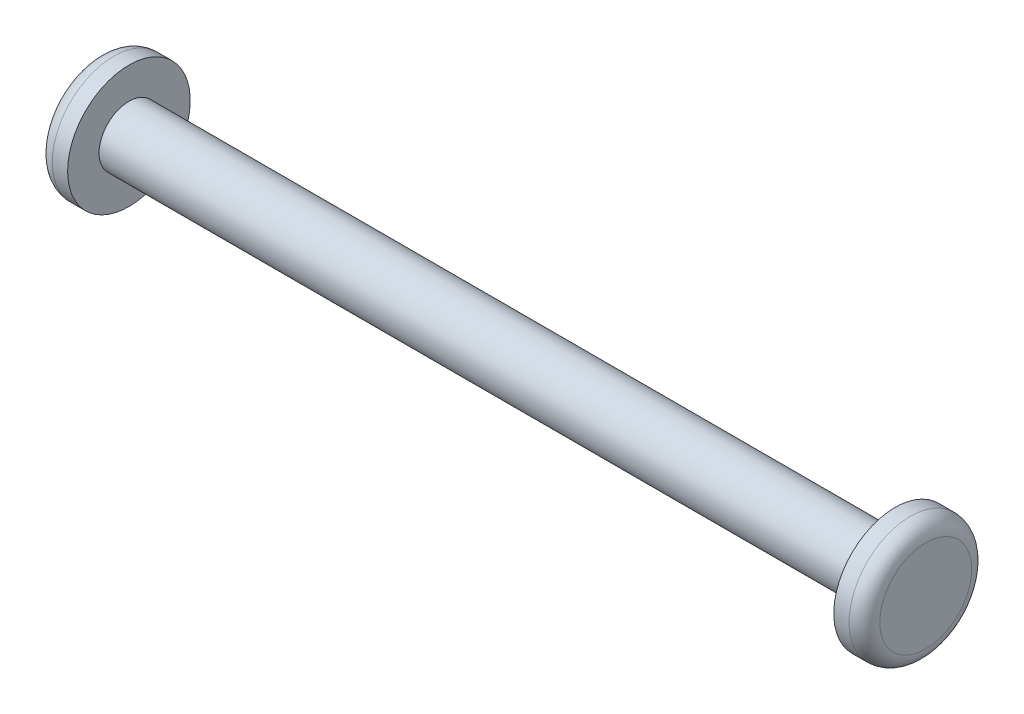
ISO-10303-21;
HEADER;
FILE_DESCRIPTION(('STEP AP214'),'2;1');
FILE_NAME('part.step','',(''),(''),'','','');
FILE_SCHEMA(('AUTOMOTIVE_DESIGN { 1 0 10303 214 1 1 1 1 }'));
ENDSEC;
DATA;
#1=APPLICATION_CONTEXT('core data for automotive mechanical design processes');
#2=APPLICATION_PROTOCOL_DEFINITION('international standard','automotive_design',2000,#1);
#3=PRODUCT_CONTEXT('',#1,'mechanical');
#4=PRODUCT('Part','Part','',(#3));
#5=PRODUCT_RELATED_PRODUCT_CATEGORY('part','',(#4));
#6=PRODUCT_DEFINITION_FORMATION('','',#4);
#7=PRODUCT_DEFINITION_CONTEXT('part definition',#1,'design');
#8=PRODUCT_DEFINITION('design','',#6,#7);
#9=PRODUCT_DEFINITION_SHAPE('','',#8);
#10=(LENGTH_UNIT() NAMED_UNIT(*) SI_UNIT(.MILLI.,.METRE.));
#11=(NAMED_UNIT(*) PLANE_ANGLE_UNIT() SI_UNIT($,.RADIAN.));
#12=(NAMED_UNIT(*) SI_UNIT($,.STERADIAN.) SOLID_ANGLE_UNIT());
#13=UNCERTAINTY_MEASURE_WITH_UNIT(LENGTH_MEASURE(1.E-05),#10,'distance_accuracy_value','');
#14=(GEOMETRIC_REPRESENTATION_CONTEXT(3) GLOBAL_UNCERTAINTY_ASSIGNED_CONTEXT((#13)) GLOBAL_UNIT_ASSIGNED_CONTEXT((#10,
#11,#12)) REPRESENTATION_CONTEXT('',''));
#15=CARTESIAN_POINT('',(0.,0.,0.));
#16=DIRECTION('',(0.,0.,1.));
#17=DIRECTION('',(1.,0.,0.));
#18=AXIS2_PLACEMENT_3D('',#15,#16,#17);
#19=CARTESIAN_POINT('',(-74.,5.,-185.068788376854));
#20=DIRECTION('',(1.,0.,0.));
#21=DIRECTION('',(0.,0.,-1.));
#22=AXIS2_PLACEMENT_3D('',#19,#20,#21);
#23=CYLINDRICAL_SURFACE('',#22,3.99999999999999);
#24=CARTESIAN_POINT('',(-73.,5.,-185.068788376854));
#25=DIRECTION('',(1.,0.,0.));
#26=DIRECTION('',(0.,0.,-1.));
#27=AXIS2_PLACEMENT_3D('',#24,#25,#26);
#28=CIRCLE('',#27,3.99999999999999);
#29=CARTESIAN_POINT('',(-73.,5.,-189.068788376854));
#30=VERTEX_POINT('',#29);
#31=EDGE_CURVE('E10',#30,#30,#28,.F.);
#32=ORIENTED_EDGE('',*,*,#31,.T.);
#33=EDGE_LOOP('',(#32));
#34=FACE_BOUND('',#33,.T.);
#35=CARTESIAN_POINT('',(-74.,5.,-185.068788376854));
#36=DIRECTION('',(1.,0.,0.));
#37=DIRECTION('',(0.,0.,-1.));
#38=AXIS2_PLACEMENT_3D('',#35,#36,#37);
#39=CIRCLE('',#38,3.99999999999999);
#40=CARTESIAN_POINT('',(-74.,5.,-189.068788376854));
#41=VERTEX_POINT('',#40);
#42=EDGE_CURVE('E60',#41,#41,#39,.T.);
#43=ORIENTED_EDGE('',*,*,#42,.T.);
#44=EDGE_LOOP('',(#43));
#45=FACE_BOUND('',#44,.T.);
#46=ADVANCED_FACE('F39',(#34,#45),#23,.T.);
#47=CARTESIAN_POINT('',(-129.,5.,-185.068788376854));
#48=DIRECTION('',(1.,0.,0.));
#49=DIRECTION('',(0.,0.,-1.));
#50=AXIS2_PLACEMENT_3D('',#47,#48,#49);
#51=CYLINDRICAL_SURFACE('',#50,1.95);
#52=CARTESIAN_POINT('',(-74.,5.,-185.068788376854));
#53=DIRECTION('',(-1.,0.,0.));
#54=DIRECTION('',(0.,0.,1.));
#55=AXIS2_PLACEMENT_3D('',#52,#53,#54);
#56=CIRCLE('',#55,1.95);
#57=CARTESIAN_POINT('',(-74.,5.,-183.118788376854));
#58=VERTEX_POINT('',#57);
#59=EDGE_CURVE('E59',#58,#58,#56,.T.);
#60=ORIENTED_EDGE('',*,*,#59,.T.);
#61=EDGE_LOOP('',(#60));
#62=FACE_BOUND('',#61,.T.);
#63=CARTESIAN_POINT('',(-124.,5.,-185.068788376854));
#64=DIRECTION('',(-1.,0.,0.));
#65=DIRECTION('',(0.,0.,1.));
#66=AXIS2_PLACEMENT_3D('',#63,#64,#65);
#67=CIRCLE('',#66,1.95);
#68=CARTESIAN_POINT('',(-124.,5.,-183.118788376854));
#69=VERTEX_POINT('',#68);
#70=EDGE_CURVE('E63',#69,#69,#67,.T.);
#71=ORIENTED_EDGE('',*,*,#70,.F.);
#72=EDGE_LOOP('',(#71));
#73=FACE_BOUND('',#72,.T.);
#74=ADVANCED_FACE('F92',(#62,#73),#51,.T.);
#75=CARTESIAN_POINT('',(-74.,5.,-185.068788376854));
#76=DIRECTION('',(1.,0.,0.));
#77=DIRECTION('',(0.,0.,-1.));
#78=AXIS2_PLACEMENT_3D('',#75,#76,#77);
#79=PLANE('',#78);
#80=ORIENTED_EDGE('',*,*,#59,.F.);
#81=EDGE_LOOP('',(#80));
#82=FACE_BOUND('',#81,.T.);
#83=ORIENTED_EDGE('',*,*,#42,.F.);
#84=EDGE_LOOP('',(#83));
#85=FACE_BOUND('',#84,.T.);
#86=ADVANCED_FACE('F97',(#82,#85),#79,.F.);
#87=CARTESIAN_POINT('',(-126.,5.,-185.068788376854));
#88=DIRECTION('',(1.,0.,0.));
#89=DIRECTION('',(0.,0.,-1.));
#90=AXIS2_PLACEMENT_3D('',#87,#88,#89);
#91=CYLINDRICAL_SURFACE('',#90,3.99999999999999);
#92=CARTESIAN_POINT('',(-125.,5.,-185.068788376854));
#93=DIRECTION('',(-1.,0.,0.));
#94=DIRECTION('',(0.,0.,1.));
#95=AXIS2_PLACEMENT_3D('',#92,#93,#94);
#96=CIRCLE('',#95,3.99999999999999);
#97=CARTESIAN_POINT('',(-125.,5.,-181.068788376854));
#98=VERTEX_POINT('',#97);
#99=EDGE_CURVE('E50',#98,#98,#96,.F.);
#100=ORIENTED_EDGE('',*,*,#99,.T.);
#101=EDGE_LOOP('',(#100));
#102=FACE_BOUND('',#101,.T.);
#103=CARTESIAN_POINT('',(-124.,5.,-185.068788376854));
#104=DIRECTION('',(-1.,0.,0.));
#105=DIRECTION('',(0.,0.,1.));
#106=AXIS2_PLACEMENT_3D('',#103,#104,#105);
#107=CIRCLE('',#106,3.99999999999999);
#108=CARTESIAN_POINT('',(-124.,5.,-181.068788376854));
#109=VERTEX_POINT('',#108);
#110=EDGE_CURVE('E68',#109,#109,#107,.T.);
#111=ORIENTED_EDGE('',*,*,#110,.T.);
#112=EDGE_LOOP('',(#111));
#113=FACE_BOUND('',#112,.T.);
#114=ADVANCED_FACE('F72',(#102,#113),#91,.T.);
#115=CARTESIAN_POINT('',(-126.,5.,-185.068788376854));
#116=DIRECTION('',(-1.,0.,0.));
#117=DIRECTION('',(0.,0.,1.));
#118=AXIS2_PLACEMENT_3D('',#115,#116,#117);
#119=PLANE('',#118);
#120=CARTESIAN_POINT('',(-126.,5.,-185.068788376854));
#121=DIRECTION('',(-1.,0.,0.));
#122=DIRECTION('',(0.,0.,1.));
#123=AXIS2_PLACEMENT_3D('',#120,#121,#122);
#124=CIRCLE('',#123,2.99999999999999);
#125=CARTESIAN_POINT('',(-126.,5.,-182.068788376854));
#126=VERTEX_POINT('',#125);
#127=EDGE_CURVE('E54',#126,#126,#124,.T.);
#128=ORIENTED_EDGE('',*,*,#127,.T.);
#129=EDGE_LOOP('',(#128));
#130=FACE_BOUND('',#129,.T.);
#131=ADVANCED_FACE('F77',(#130),#119,.T.);
#132=CARTESIAN_POINT('',(-124.,5.,-185.068788376854));
#133=DIRECTION('',(-1.,0.,0.));
#134=DIRECTION('',(0.,0.,1.));
#135=AXIS2_PLACEMENT_3D('',#132,#133,#134);
#136=PLANE('',#135);
#137=ORIENTED_EDGE('',*,*,#70,.T.);
#138=EDGE_LOOP('',(#137));
#139=FACE_BOUND('',#138,.T.);
#140=ORIENTED_EDGE('',*,*,#110,.F.);
#141=EDGE_LOOP('',(#140));
#142=FACE_BOUND('',#141,.T.);
#143=ADVANCED_FACE('F74',(#139,#142),#136,.F.);
#144=CARTESIAN_POINT('',(-125.,5.,-185.068788376854));
#145=DIRECTION('',(-1.,0.,0.));
#146=DIRECTION('',(0.,0.,1.));
#147=AXIS2_PLACEMENT_3D('',#144,#145,#146);
#148=TOROIDAL_SURFACE('',#147,2.99999999999999,1.);
#149=ORIENTED_EDGE('',*,*,#99,.F.);
#150=EDGE_LOOP('',(#149));
#151=FACE_BOUND('',#150,.T.);
#152=ORIENTED_EDGE('',*,*,#127,.F.);
#153=EDGE_LOOP('',(#152));
#154=FACE_BOUND('',#153,.T.);
#155=ADVANCED_FACE('F76',(#151,#154),#148,.T.);
#156=CARTESIAN_POINT('',(-72.,5.,-185.068788376854));
#157=DIRECTION('',(1.,0.,0.));
#158=DIRECTION('',(0.,0.,-1.));
#159=AXIS2_PLACEMENT_3D('',#156,#157,#158);
#160=PLANE('',#159);
#161=CARTESIAN_POINT('',(-72.,5.,-185.068788376854));
#162=DIRECTION('',(1.,0.,0.));
#163=DIRECTION('',(0.,0.,-1.));
#164=AXIS2_PLACEMENT_3D('',#161,#162,#163);
#165=CIRCLE('',#164,2.99999999999999);
#166=CARTESIAN_POINT('',(-72.,5.,-188.068788376854));
#167=VERTEX_POINT('',#166);
#168=EDGE_CURVE('E46',#167,#167,#165,.T.);
#169=ORIENTED_EDGE('',*,*,#168,.T.);
#170=EDGE_LOOP('',(#169));
#171=FACE_BOUND('',#170,.T.);
#172=ADVANCED_FACE('F85',(#171),#160,.T.);
#173=CARTESIAN_POINT('',(-73.,5.,-185.068788376854));
#174=DIRECTION('',(1.,0.,0.));
#175=DIRECTION('',(0.,0.,-1.));
#176=AXIS2_PLACEMENT_3D('',#173,#174,#175);
#177=TOROIDAL_SURFACE('',#176,2.99999999999999,1.);
#178=ORIENTED_EDGE('',*,*,#31,.F.);
#179=EDGE_LOOP('',(#178));
#180=FACE_BOUND('',#179,.T.);
#181=ORIENTED_EDGE('',*,*,#168,.F.);
#182=EDGE_LOOP('',(#181));
#183=FACE_BOUND('',#182,.T.);
#184=ADVANCED_FACE('F41',(#180,#183),#177,.T.);
#185=CLOSED_SHELL('',(#46,#74,#86,#114,#131,#143,#155,#172,#184));
#186=MANIFOLD_SOLID_BREP('B2',#185);
#187=ADVANCED_BREP_SHAPE_REPRESENTATION('',(#18,#186),#14);
#188=SHAPE_DEFINITION_REPRESENTATION(#9,#187);
ENDSEC;
END-ISO-10303-21;
